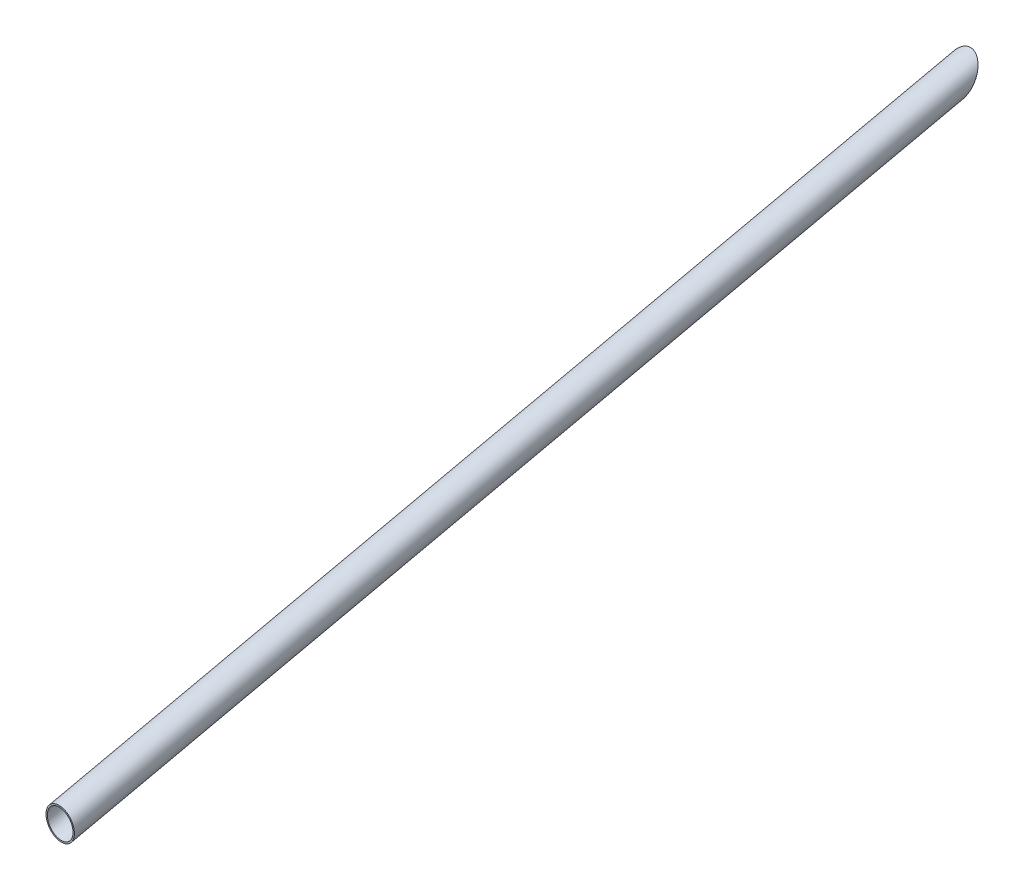
ISO-10303-21;
HEADER;
FILE_DESCRIPTION(('STEP AP214'),'2;1');
FILE_NAME('part.step','',(''),(''),'','','');
FILE_SCHEMA(('AUTOMOTIVE_DESIGN { 1 0 10303 214 1 1 1 1 }'));
ENDSEC;
DATA;
#1=APPLICATION_CONTEXT('core data for automotive mechanical design processes');
#2=APPLICATION_PROTOCOL_DEFINITION('international standard','automotive_design',2000,#1);
#3=PRODUCT_CONTEXT('',#1,'mechanical');
#4=PRODUCT('Part','Part','',(#3));
#5=PRODUCT_RELATED_PRODUCT_CATEGORY('part','',(#4));
#6=PRODUCT_DEFINITION_FORMATION('','',#4);
#7=PRODUCT_DEFINITION_CONTEXT('part definition',#1,'design');
#8=PRODUCT_DEFINITION('design','',#6,#7);
#9=PRODUCT_DEFINITION_SHAPE('','',#8);
#10=(LENGTH_UNIT() NAMED_UNIT(*) SI_UNIT(.MILLI.,.METRE.));
#11=(NAMED_UNIT(*) PLANE_ANGLE_UNIT() SI_UNIT($,.RADIAN.));
#12=(NAMED_UNIT(*) SI_UNIT($,.STERADIAN.) SOLID_ANGLE_UNIT());
#13=UNCERTAINTY_MEASURE_WITH_UNIT(LENGTH_MEASURE(1.E-05),#10,'distance_accuracy_value','');
#14=(GEOMETRIC_REPRESENTATION_CONTEXT(3) GLOBAL_UNCERTAINTY_ASSIGNED_CONTEXT((#13)) GLOBAL_UNIT_ASSIGNED_CONTEXT((#10,
#11,#12)) REPRESENTATION_CONTEXT('',''));
#15=CARTESIAN_POINT('',(0.,0.,0.));
#16=DIRECTION('',(0.,0.,1.));
#17=DIRECTION('',(1.,0.,0.));
#18=AXIS2_PLACEMENT_3D('',#15,#16,#17);
#19=CARTESIAN_POINT('',(169.428571428571,1.66533453693773E-13,-994.999999999999));
#20=DIRECTION('',(0.227207840964846,0.4673512982197,-0.85437659205789));
#21=DIRECTION('',(0.,0.877321812102288,0.479902529696977));
#22=AXIS2_PLACEMENT_3D('',#19,#20,#21);
#23=CYLINDRICAL_SURFACE('',#22,11.3);
#24=CARTESIAN_POINT('',(169.428571428571,1.61631825483159E-13,-994.999999999999));
#25=DIRECTION('',(-0.0733678743643171,-0.0691920948731019,0.994901808732064));
#26=DIRECTION('',(0.368237148377429,0.925218330098196,0.0915010612242572));
#27=AXIS2_PLACEMENT_3D('',#24,#25,#26);
#28=ELLIPSE('',#27,12.5691359696722,11.3);
#29=CARTESIAN_POINT('',(174.056994215611,11.6291949926374,-993.849910720102));
#30=VERTEX_POINT('',#29);
#31=EDGE_CURVE('E53',#30,#30,#28,.T.);
#32=ORIENTED_EDGE('',*,*,#31,.T.);
#33=EDGE_LOOP('',(#32));
#34=FACE_BOUND('',#33,.T.);
#35=CARTESIAN_POINT('',(325.,320.,-1580.));
#36=DIRECTION('',(0.0100583123703582,-0.349879267870479,-0.936740801004567));
#37=DIRECTION('',(0.287052887423583,0.898369431045867,-0.332465043552115));
#38=AXIS2_PLACEMENT_3D('',#35,#36,#37);
#39=ELLIPSE('',#38,17.681163572203,11.3);
#40=CARTESIAN_POINT('',(330.07542905641,335.884216858589,-1585.87836881708));
#41=VERTEX_POINT('',#40);
#42=EDGE_CURVE('E43',#41,#41,#39,.T.);
#43=ORIENTED_EDGE('',*,*,#42,.T.);
#44=EDGE_LOOP('',(#43));
#45=FACE_BOUND('',#44,.T.);
#46=ADVANCED_FACE('F39',(#34,#45),#23,.F.);
#47=CARTESIAN_POINT('',(169.428571428571,1.66533453693773E-13,-994.999999999999));
#48=DIRECTION('',(0.227207840964846,0.4673512982197,-0.85437659205789));
#49=DIRECTION('',(0.,0.877321812102288,0.479902529696977));
#50=AXIS2_PLACEMENT_3D('',#47,#48,#49);
#51=CYLINDRICAL_SURFACE('',#50,12.5);
#52=CARTESIAN_POINT('',(169.428571428571,1.61631825483159E-13,-994.999999999999));
#53=DIRECTION('',(-0.0733678743643171,-0.0691920948731019,0.994901808732064));
#54=DIRECTION('',(0.368237148377429,0.925218330098196,0.0915010612242572));
#55=AXIS2_PLACEMENT_3D('',#52,#53,#54);
#56=ELLIPSE('',#55,13.9039114708763,12.5);
#57=CARTESIAN_POINT('',(174.548508139899,12.8641537529175,-993.727777345246));
#58=VERTEX_POINT('',#57);
#59=EDGE_CURVE('E47',#58,#58,#56,.T.);
#60=ORIENTED_EDGE('',*,*,#59,.F.);
#61=EDGE_LOOP('',(#60));
#62=FACE_BOUND('',#61,.T.);
#63=CARTESIAN_POINT('',(325.,320.,-1580.));
#64=DIRECTION('',(0.0100583123703582,-0.349879267870479,-0.936740801004567));
#65=DIRECTION('',(0.287052887423583,0.898369431045867,-0.332465043552115));
#66=AXIS2_PLACEMENT_3D('',#63,#64,#65);
#67=ELLIPSE('',#66,19.5588092612866,12.5);
#68=CARTESIAN_POINT('',(330.614412673019,337.571036347997,-1586.50262037288));
#69=VERTEX_POINT('',#68);
#70=EDGE_CURVE('E10',#69,#69,#67,.T.);
#71=ORIENTED_EDGE('',*,*,#70,.F.);
#72=EDGE_LOOP('',(#71));
#73=FACE_BOUND('',#72,.T.);
#74=ADVANCED_FACE('F67',(#62,#73),#51,.T.);
#75=CARTESIAN_POINT('',(169.428571428571,0.,-994.999999999999));
#76=DIRECTION('',(-0.0733678743643171,-0.0691920948731019,0.994901808732064));
#77=DIRECTION('',(0.997291963479987,0.,0.0735441335405672));
#78=AXIS2_PLACEMENT_3D('',#75,#76,#77);
#79=PLANE('',#78);
#80=ORIENTED_EDGE('',*,*,#31,.F.);
#81=EDGE_LOOP('',(#80));
#82=FACE_BOUND('',#81,.T.);
#83=ORIENTED_EDGE('',*,*,#59,.T.);
#84=EDGE_LOOP('',(#83));
#85=FACE_BOUND('',#84,.T.);
#86=ADVANCED_FACE('F62',(#82,#85),#79,.T.);
#87=CARTESIAN_POINT('',(325.,320.,-1580.));
#88=DIRECTION('',(0.0100583123703582,-0.349879267870479,-0.936740801004567));
#89=DIRECTION('',(0.,0.936788189468734,-0.349896967794653));
#90=AXIS2_PLACEMENT_3D('',#87,#88,#89);
#91=PLANE('',#90);
#92=ORIENTED_EDGE('',*,*,#42,.F.);
#93=EDGE_LOOP('',(#92));
#94=FACE_BOUND('',#93,.T.);
#95=ORIENTED_EDGE('',*,*,#70,.T.);
#96=EDGE_LOOP('',(#95));
#97=FACE_BOUND('',#96,.T.);
#98=ADVANCED_FACE('F41',(#94,#97),#91,.T.);
#99=CLOSED_SHELL('',(#46,#74,#86,#98));
#100=MANIFOLD_SOLID_BREP('B2',#99);
#101=ADVANCED_BREP_SHAPE_REPRESENTATION('',(#18,#100),#14);
#102=SHAPE_DEFINITION_REPRESENTATION(#9,#101);
ENDSEC;
END-ISO-10303-21;
